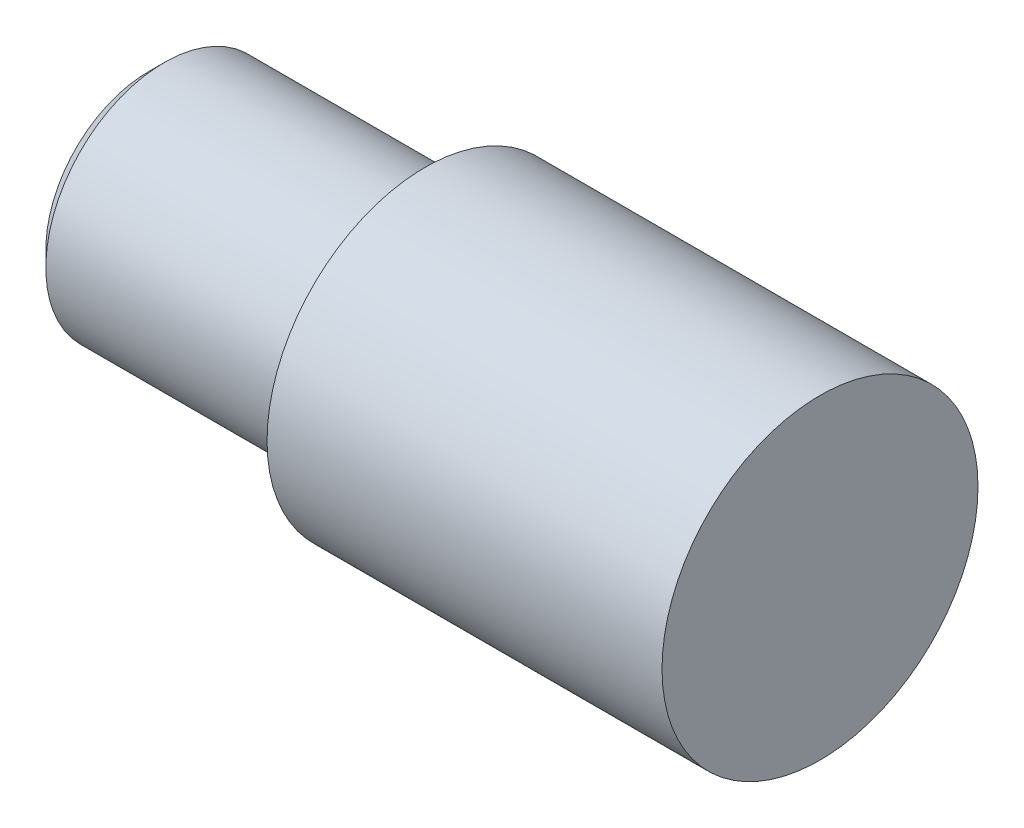
ISO-10303-21;
HEADER;
FILE_DESCRIPTION(('STEP AP214'),'2;1');
FILE_NAME('part.step','',(''),(''),'','','');
FILE_SCHEMA(('AUTOMOTIVE_DESIGN { 1 0 10303 214 1 1 1 1 }'));
ENDSEC;
DATA;
#1=APPLICATION_CONTEXT('core data for automotive mechanical design processes');
#2=APPLICATION_PROTOCOL_DEFINITION('international standard','automotive_design',2000,#1);
#3=PRODUCT_CONTEXT('',#1,'mechanical');
#4=PRODUCT('Part','Part','',(#3));
#5=PRODUCT_RELATED_PRODUCT_CATEGORY('part','',(#4));
#6=PRODUCT_DEFINITION_FORMATION('','',#4);
#7=PRODUCT_DEFINITION_CONTEXT('part definition',#1,'design');
#8=PRODUCT_DEFINITION('design','',#6,#7);
#9=PRODUCT_DEFINITION_SHAPE('','',#8);
#10=(LENGTH_UNIT() NAMED_UNIT(*) SI_UNIT(.MILLI.,.METRE.));
#11=(NAMED_UNIT(*) PLANE_ANGLE_UNIT() SI_UNIT($,.RADIAN.));
#12=(NAMED_UNIT(*) SI_UNIT($,.STERADIAN.) SOLID_ANGLE_UNIT());
#13=UNCERTAINTY_MEASURE_WITH_UNIT(LENGTH_MEASURE(1.E-05),#10,'distance_accuracy_value','');
#14=(GEOMETRIC_REPRESENTATION_CONTEXT(3) GLOBAL_UNCERTAINTY_ASSIGNED_CONTEXT((#13)) GLOBAL_UNIT_ASSIGNED_CONTEXT((#10,
#11,#12)) REPRESENTATION_CONTEXT('',''));
#15=CARTESIAN_POINT('',(0.,0.,0.));
#16=DIRECTION('',(0.,0.,1.));
#17=DIRECTION('',(1.,0.,0.));
#18=AXIS2_PLACEMENT_3D('',#15,#16,#17);
#19=CARTESIAN_POINT('',(0.,0.,0.));
#20=DIRECTION('',(1.,0.,0.));
#21=DIRECTION('',(0.,0.,-1.));
#22=AXIS2_PLACEMENT_3D('',#19,#20,#21);
#23=PLANE('',#22);
#24=CARTESIAN_POINT('',(0.,0.,0.));
#25=DIRECTION('',(1.,0.,0.));
#26=DIRECTION('',(0.,0.,-1.));
#27=AXIS2_PLACEMENT_3D('',#24,#25,#26);
#28=CIRCLE('',#27,2.);
#29=CARTESIAN_POINT('',(0.,0.,-2.));
#30=VERTEX_POINT('',#29);
#31=EDGE_CURVE('E55',#30,#30,#28,.T.);
#32=ORIENTED_EDGE('',*,*,#31,.F.);
#33=EDGE_LOOP('',(#32));
#34=FACE_BOUND('',#33,.T.);
#35=CARTESIAN_POINT('',(0.,0.,0.));
#36=DIRECTION('',(1.,0.,0.));
#37=DIRECTION('',(0.,0.,-1.));
#38=AXIS2_PLACEMENT_3D('',#35,#36,#37);
#39=CIRCLE('',#38,1.5);
#40=CARTESIAN_POINT('',(0.,0.,-1.5));
#41=VERTEX_POINT('',#40);
#42=EDGE_CURVE('E48',#41,#41,#39,.F.);
#43=ORIENTED_EDGE('',*,*,#42,.F.);
#44=EDGE_LOOP('',(#43));
#45=FACE_BOUND('',#44,.T.);
#46=ADVANCED_FACE('F37',(#34,#45),#23,.F.);
#47=CARTESIAN_POINT('',(5.,0.,0.));
#48=DIRECTION('',(-1.,0.,0.));
#49=DIRECTION('',(0.,0.,1.));
#50=AXIS2_PLACEMENT_3D('',#47,#48,#49);
#51=CYLINDRICAL_SURFACE('',#50,2.);
#52=CARTESIAN_POINT('',(5.,0.,0.));
#53=DIRECTION('',(1.,0.,0.));
#54=DIRECTION('',(0.,0.,-1.));
#55=AXIS2_PLACEMENT_3D('',#52,#53,#54);
#56=CIRCLE('',#55,2.);
#57=CARTESIAN_POINT('',(5.,0.,-2.));
#58=VERTEX_POINT('',#57);
#59=EDGE_CURVE('E52',#58,#58,#56,.T.);
#60=ORIENTED_EDGE('',*,*,#59,.F.);
#61=EDGE_LOOP('',(#60));
#62=FACE_BOUND('',#61,.T.);
#63=ORIENTED_EDGE('',*,*,#31,.T.);
#64=EDGE_LOOP('',(#63));
#65=FACE_BOUND('',#64,.T.);
#66=ADVANCED_FACE('F63',(#62,#65),#51,.T.);
#67=CARTESIAN_POINT('',(5.,0.,0.));
#68=DIRECTION('',(1.,0.,0.));
#69=DIRECTION('',(0.,0.,-1.));
#70=AXIS2_PLACEMENT_3D('',#67,#68,#69);
#71=PLANE('',#70);
#72=ORIENTED_EDGE('',*,*,#59,.T.);
#73=EDGE_LOOP('',(#72));
#74=FACE_BOUND('',#73,.T.);
#75=ADVANCED_FACE('F61',(#74),#71,.T.);
#76=CARTESIAN_POINT('',(-3.5,0.,0.));
#77=DIRECTION('',(1.,0.,0.));
#78=DIRECTION('',(0.,0.,-1.));
#79=AXIS2_PLACEMENT_3D('',#76,#77,#78);
#80=CYLINDRICAL_SURFACE('',#79,1.5);
#81=CARTESIAN_POINT('',(-3.3,0.,0.));
#82=DIRECTION('',(-1.,0.,0.));
#83=DIRECTION('',(0.,0.,1.));
#84=AXIS2_PLACEMENT_3D('',#81,#82,#83);
#85=CIRCLE('',#84,1.5);
#86=CARTESIAN_POINT('',(-3.3,0.,-1.5));
#87=VERTEX_POINT('',#86);
#88=EDGE_CURVE('E10',#87,#87,#85,.F.);
#89=ORIENTED_EDGE('',*,*,#88,.T.);
#90=EDGE_LOOP('',(#89));
#91=FACE_BOUND('',#90,.T.);
#92=ORIENTED_EDGE('',*,*,#42,.T.);
#93=EDGE_LOOP('',(#92));
#94=FACE_BOUND('',#93,.T.);
#95=ADVANCED_FACE('F73',(#91,#94),#80,.T.);
#96=CARTESIAN_POINT('',(-3.5,0.,0.));
#97=DIRECTION('',(-1.,0.,0.));
#98=DIRECTION('',(0.,0.,1.));
#99=AXIS2_PLACEMENT_3D('',#96,#97,#98);
#100=PLANE('',#99);
#101=CARTESIAN_POINT('',(-3.5,0.,0.));
#102=DIRECTION('',(-1.,0.,0.));
#103=DIRECTION('',(0.,0.,1.));
#104=AXIS2_PLACEMENT_3D('',#101,#102,#103);
#105=CIRCLE('',#104,1.3);
#106=CARTESIAN_POINT('',(-3.5,0.,-1.3));
#107=VERTEX_POINT('',#106);
#108=EDGE_CURVE('E44',#107,#107,#105,.T.);
#109=ORIENTED_EDGE('',*,*,#108,.T.);
#110=EDGE_LOOP('',(#109));
#111=FACE_BOUND('',#110,.T.);
#112=ADVANCED_FACE('F75',(#111),#100,.T.);
#113=CARTESIAN_POINT('',(-3.5,0.,0.));
#114=DIRECTION('',(1.,0.,0.));
#115=DIRECTION('',(0.,0.,-1.));
#116=AXIS2_PLACEMENT_3D('',#113,#114,#115);
#117=CONICAL_SURFACE('',#116,1.3,0.785398163397448);
#118=CARTESIAN_POINT('',(-3.3,0.,-1.5));
#119=CARTESIAN_POINT('',(-3.30208333333333,0.,-1.49791666666667));
#120=CARTESIAN_POINT('',(-3.30416666666667,0.,-1.49583333333333));
#121=CARTESIAN_POINT('',(-3.30833333333333,0.,-1.49166666666667));
#122=CARTESIAN_POINT('',(-3.31041666666667,0.,-1.48958333333333));
#123=CARTESIAN_POINT('',(-3.31458333333333,0.,-1.48541666666667));
#124=CARTESIAN_POINT('',(-3.31666666666667,0.,-1.48333333333333));
#125=CARTESIAN_POINT('',(-3.32083333333333,0.,-1.47916666666667));
#126=CARTESIAN_POINT('',(-3.32291666666667,0.,-1.47708333333333));
#127=CARTESIAN_POINT('',(-3.32708333333333,0.,-1.47291666666667));
#128=CARTESIAN_POINT('',(-3.32916666666667,0.,-1.47083333333333));
#129=CARTESIAN_POINT('',(-3.33333333333333,0.,-1.46666666666667));
#130=CARTESIAN_POINT('',(-3.33541666666667,0.,-1.46458333333333));
#131=CARTESIAN_POINT('',(-3.33958333333333,0.,-1.46041666666667));
#132=CARTESIAN_POINT('',(-3.34166666666667,0.,-1.45833333333333));
#133=CARTESIAN_POINT('',(-3.34583333333333,0.,-1.45416666666667));
#134=CARTESIAN_POINT('',(-3.34791666666667,0.,-1.45208333333333));
#135=CARTESIAN_POINT('',(-3.35208333333333,0.,-1.44791666666667));
#136=CARTESIAN_POINT('',(-3.35416666666667,0.,-1.44583333333333));
#137=CARTESIAN_POINT('',(-3.35833333333333,0.,-1.44166666666667));
#138=CARTESIAN_POINT('',(-3.36041666666667,0.,-1.43958333333333));
#139=CARTESIAN_POINT('',(-3.36458333333333,0.,-1.43541666666667));
#140=CARTESIAN_POINT('',(-3.36666666666667,0.,-1.43333333333333));
#141=CARTESIAN_POINT('',(-3.37083333333333,0.,-1.42916666666667));
#142=CARTESIAN_POINT('',(-3.37291666666667,0.,-1.42708333333333));
#143=CARTESIAN_POINT('',(-3.37708333333333,0.,-1.42291666666667));
#144=CARTESIAN_POINT('',(-3.37916666666667,0.,-1.42083333333333));
#145=CARTESIAN_POINT('',(-3.38333333333333,0.,-1.41666666666667));
#146=CARTESIAN_POINT('',(-3.38541666666667,0.,-1.41458333333333));
#147=CARTESIAN_POINT('',(-3.38958333333333,0.,-1.41041666666667));
#148=CARTESIAN_POINT('',(-3.39166666666667,0.,-1.40833333333333));
#149=CARTESIAN_POINT('',(-3.39583333333333,0.,-1.40416666666667));
#150=CARTESIAN_POINT('',(-3.39791666666667,0.,-1.40208333333333));
#151=CARTESIAN_POINT('',(-3.40208333333333,0.,-1.39791666666667));
#152=CARTESIAN_POINT('',(-3.40416666666667,0.,-1.39583333333333));
#153=CARTESIAN_POINT('',(-3.40833333333333,0.,-1.39166666666667));
#154=CARTESIAN_POINT('',(-3.41041666666667,0.,-1.38958333333333));
#155=CARTESIAN_POINT('',(-3.41458333333333,0.,-1.38541666666667));
#156=CARTESIAN_POINT('',(-3.41666666666667,0.,-1.38333333333333));
#157=CARTESIAN_POINT('',(-3.42083333333333,0.,-1.37916666666667));
#158=CARTESIAN_POINT('',(-3.42291666666667,0.,-1.37708333333333));
#159=CARTESIAN_POINT('',(-3.42708333333333,0.,-1.37291666666667));
#160=CARTESIAN_POINT('',(-3.42916666666667,0.,-1.37083333333333));
#161=CARTESIAN_POINT('',(-3.43333333333333,0.,-1.36666666666667));
#162=CARTESIAN_POINT('',(-3.43541666666667,0.,-1.36458333333333));
#163=CARTESIAN_POINT('',(-3.43958333333333,0.,-1.36041666666667));
#164=CARTESIAN_POINT('',(-3.44166666666667,0.,-1.35833333333333));
#165=CARTESIAN_POINT('',(-3.44583333333333,0.,-1.35416666666667));
#166=CARTESIAN_POINT('',(-3.44791666666667,0.,-1.35208333333333));
#167=CARTESIAN_POINT('',(-3.45208333333333,0.,-1.34791666666667));
#168=CARTESIAN_POINT('',(-3.45416666666667,0.,-1.34583333333333));
#169=CARTESIAN_POINT('',(-3.45833333333333,0.,-1.34166666666667));
#170=CARTESIAN_POINT('',(-3.46041666666667,0.,-1.33958333333333));
#171=CARTESIAN_POINT('',(-3.46458333333333,0.,-1.33541666666667));
#172=CARTESIAN_POINT('',(-3.46666666666667,0.,-1.33333333333333));
#173=CARTESIAN_POINT('',(-3.47083333333333,0.,-1.32916666666667));
#174=CARTESIAN_POINT('',(-3.47291666666667,0.,-1.32708333333333));
#175=CARTESIAN_POINT('',(-3.47708333333333,0.,-1.32291666666667));
#176=CARTESIAN_POINT('',(-3.47916666666667,0.,-1.32083333333333));
#177=CARTESIAN_POINT('',(-3.48333333333333,0.,-1.31666666666667));
#178=CARTESIAN_POINT('',(-3.48541666666667,0.,-1.31458333333333));
#179=CARTESIAN_POINT('',(-3.48958333333333,0.,-1.31041666666667));
#180=CARTESIAN_POINT('',(-3.49166666666667,0.,-1.30833333333333));
#181=CARTESIAN_POINT('',(-3.49583333333333,0.,-1.30416666666667));
#182=CARTESIAN_POINT('',(-3.49791666666667,0.,-1.30208333333333));
#183=CARTESIAN_POINT('',(-3.5,0.,-1.3));
#184=B_SPLINE_CURVE_WITH_KNOTS('',3,(#118,#119,#120,#121,#122,#123,#124,#125,#126,#127,#128,
#129,#130,#131,#132,#133,#134,#135,#136,#137,#138,#139,#140,#141,#142,#143,#144,#145,#146,#147,
#148,#149,#150,#151,#152,#153,#154,#155,#156,#157,#158,#159,#160,#161,#162,#163,#164,#165,#166,
#167,#168,#169,#170,#171,#172,#173,#174,#175,#176,#177,#178,#179,#180,#181,#182,#183),
.UNSPECIFIED.,.F.,.F.,(4,2,2,2,2,2,2,2,2,2,2,2,2,2,2,2,2,2,2,2,2,2,2,2,2,2,2,2,2,2,2,2,4),(0.,
0.00883883476483164,0.0176776695296636,0.0265165042944952,0.0353553390593272,0.044194173824159,
0.0530330085889909,0.0618718433538228,0.0707106781186545,0.0795495128834864,0.0883883476483181,
0.09722718241315,0.106066017177982,0.114904851942814,0.123743686707645,0.132582521472477,
0.141421356237309,0.150260191002141,0.159099025766973,0.167937860531804,0.176776695296636,
0.185615530061468,0.1944543648263,0.203293199591132,0.212132034355964,0.220970869120795,
0.229809703885627,0.238648538650459,0.247487373415291,0.256326208180123,0.265165042944954,
0.274003877709786,0.282842712474618),.UNSPECIFIED.);
#185=EDGE_CURVE('BSEAM39',#87,#107,#184,.T.);
#186=ORIENTED_EDGE('',*,*,#88,.F.);
#187=ORIENTED_EDGE('',*,*,#108,.F.);
#188=ORIENTED_EDGE('',*,*,#185,.T.);
#189=ORIENTED_EDGE('',*,*,#185,.F.);
#190=EDGE_LOOP('',(#186,#188,#187,#189));
#191=FACE_BOUND('',#190,.T.);
#192=ADVANCED_FACE('F39',(#191),#117,.T.);
#193=CLOSED_SHELL('',(#46,#66,#75,#95,#112,#192));
#194=MANIFOLD_SOLID_BREP('B2',#193);
#195=ADVANCED_BREP_SHAPE_REPRESENTATION('',(#18,#194),#14);
#196=SHAPE_DEFINITION_REPRESENTATION(#9,#195);
ENDSEC;
END-ISO-10303-21;
